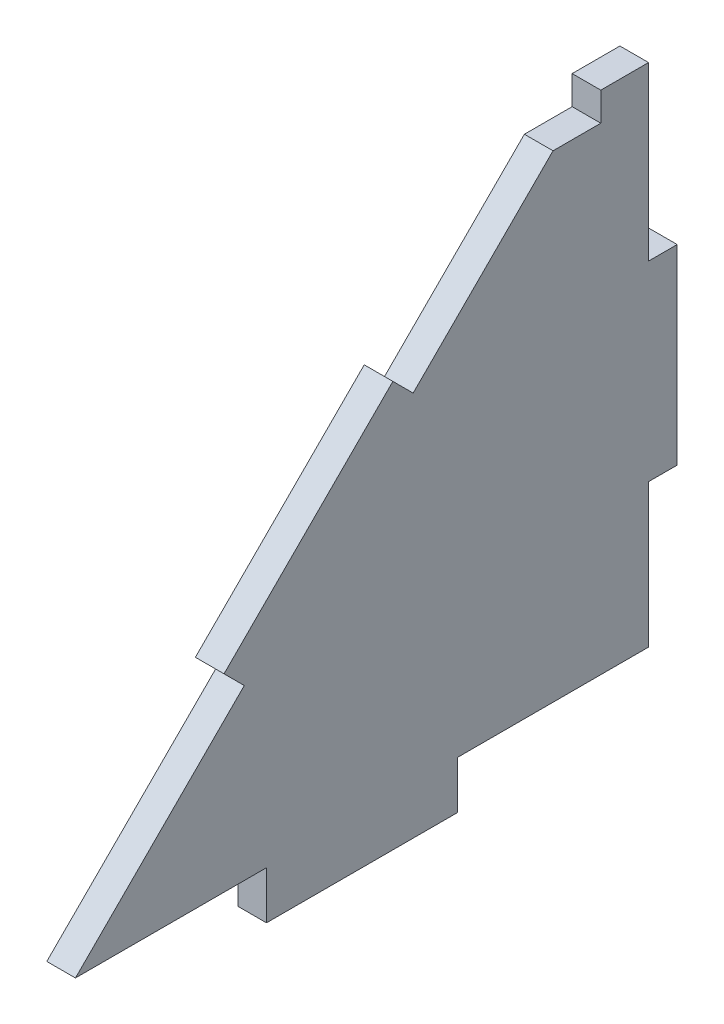
ISO-10303-21;
HEADER;
FILE_DESCRIPTION(('STEP AP214'),'2;1');
FILE_NAME('part.step','',(''),(''),'','','');
FILE_SCHEMA(('AUTOMOTIVE_DESIGN { 1 0 10303 214 1 1 1 1 }'));
ENDSEC;
DATA;
#1=APPLICATION_CONTEXT('core data for automotive mechanical design processes');
#2=APPLICATION_PROTOCOL_DEFINITION('international standard','automotive_design',2000,#1);
#3=PRODUCT_CONTEXT('',#1,'mechanical');
#4=PRODUCT('Part','Part','',(#3));
#5=PRODUCT_RELATED_PRODUCT_CATEGORY('part','',(#4));
#6=PRODUCT_DEFINITION_FORMATION('','',#4);
#7=PRODUCT_DEFINITION_CONTEXT('part definition',#1,'design');
#8=PRODUCT_DEFINITION('design','',#6,#7);
#9=PRODUCT_DEFINITION_SHAPE('','',#8);
#10=(LENGTH_UNIT() NAMED_UNIT(*) SI_UNIT(.MILLI.,.METRE.));
#11=(NAMED_UNIT(*) PLANE_ANGLE_UNIT() SI_UNIT($,.RADIAN.));
#12=(NAMED_UNIT(*) SI_UNIT($,.STERADIAN.) SOLID_ANGLE_UNIT());
#13=UNCERTAINTY_MEASURE_WITH_UNIT(LENGTH_MEASURE(1.E-05),#10,'distance_accuracy_value','');
#14=(GEOMETRIC_REPRESENTATION_CONTEXT(3) GLOBAL_UNCERTAINTY_ASSIGNED_CONTEXT((#13)) GLOBAL_UNIT_ASSIGNED_CONTEXT((#10,
#11,#12)) REPRESENTATION_CONTEXT('',''));
#15=CARTESIAN_POINT('',(0.,0.,0.));
#16=DIRECTION('',(0.,0.,1.));
#17=DIRECTION('',(1.,0.,0.));
#18=AXIS2_PLACEMENT_3D('',#15,#16,#17);
#19=CARTESIAN_POINT('',(3.,0.,-51.8));
#20=DIRECTION('',(0.,0.,-1.));
#21=DIRECTION('',(-1.,0.,0.));
#22=AXIS2_PLACEMENT_3D('',#19,#20,#21);
#23=PLANE('',#22);
#24=DIRECTION('',(0.,-1.,0.));
#25=VECTOR('',#24,1.);
#26=CARTESIAN_POINT('',(0.,0.,-51.8));
#27=LINE('',#26,#25);
#28=CARTESIAN_POINT('',(0.,50.,-51.8));
#29=VERTEX_POINT('',#28);
#30=CARTESIAN_POINT('',(0.,32.,-51.8));
#31=VERTEX_POINT('',#30);
#32=EDGE_CURVE('E203',#29,#31,#27,.T.);
#33=ORIENTED_EDGE('',*,*,#32,.F.);
#34=DIRECTION('',(-1.,0.,0.));
#35=VECTOR('',#34,1.);
#36=CARTESIAN_POINT('',(3.,50.,-51.8));
#37=LINE('',#36,#35);
#38=CARTESIAN_POINT('',(3.,50.,-51.8));
#39=VERTEX_POINT('',#38);
#40=EDGE_CURVE('E12',#39,#29,#37,.T.);
#41=ORIENTED_EDGE('',*,*,#40,.F.);
#42=DIRECTION('',(0.,-1.,0.));
#43=VECTOR('',#42,1.);
#44=CARTESIAN_POINT('',(3.,0.,-51.8));
#45=LINE('',#44,#43);
#46=CARTESIAN_POINT('',(3.,32.,-51.8));
#47=VERTEX_POINT('',#46);
#48=EDGE_CURVE('E266',#39,#47,#45,.T.);
#49=ORIENTED_EDGE('',*,*,#48,.T.);
#50=DIRECTION('',(-1.,0.,0.));
#51=VECTOR('',#50,1.);
#52=CARTESIAN_POINT('',(3.,32.,-51.8));
#53=LINE('',#52,#51);
#54=EDGE_CURVE('E63',#47,#31,#53,.T.);
#55=ORIENTED_EDGE('',*,*,#54,.T.);
#56=EDGE_LOOP('',(#33,#41,#49,#55));
#57=FACE_BOUND('',#56,.T.);
#58=ADVANCED_FACE('F46',(#57),#23,.T.);
#59=CARTESIAN_POINT('',(3.,50.,0.));
#60=DIRECTION('',(0.,1.,0.));
#61=DIRECTION('',(0.,0.,1.));
#62=AXIS2_PLACEMENT_3D('',#59,#60,#61);
#63=PLANE('',#62);
#64=DIRECTION('',(0.,0.,-1.));
#65=VECTOR('',#64,1.);
#66=CARTESIAN_POINT('',(0.,50.,0.));
#67=LINE('',#66,#65);
#68=CARTESIAN_POINT('',(0.,50.,-46.8));
#69=VERTEX_POINT('',#68);
#70=EDGE_CURVE('E206',#69,#29,#67,.T.);
#71=ORIENTED_EDGE('',*,*,#70,.F.);
#72=DIRECTION('',(-1.,0.,0.));
#73=VECTOR('',#72,1.);
#74=CARTESIAN_POINT('',(3.,50.,-46.8));
#75=LINE('',#74,#73);
#76=CARTESIAN_POINT('',(3.,50.,-46.8));
#77=VERTEX_POINT('',#76);
#78=EDGE_CURVE('E55',#77,#69,#75,.T.);
#79=ORIENTED_EDGE('',*,*,#78,.F.);
#80=DIRECTION('',(0.,0.,-1.));
#81=VECTOR('',#80,1.);
#82=CARTESIAN_POINT('',(3.,50.,0.));
#83=LINE('',#82,#81);
#84=EDGE_CURVE('E335',#77,#39,#83,.T.);
#85=ORIENTED_EDGE('',*,*,#84,.T.);
#86=ORIENTED_EDGE('',*,*,#40,.T.);
#87=EDGE_LOOP('',(#71,#79,#85,#86));
#88=FACE_BOUND('',#87,.T.);
#89=ADVANCED_FACE('F324',(#88),#63,.T.);
#90=CARTESIAN_POINT('',(3.,0.,-46.8));
#91=DIRECTION('',(0.,0.,1.));
#92=DIRECTION('',(1.,0.,0.));
#93=AXIS2_PLACEMENT_3D('',#90,#91,#92);
#94=PLANE('',#93);
#95=DIRECTION('',(0.,1.,0.));
#96=VECTOR('',#95,1.);
#97=CARTESIAN_POINT('',(0.,0.,-46.8));
#98=LINE('',#97,#96);
#99=CARTESIAN_POINT('',(0.,47.,-46.8));
#100=VERTEX_POINT('',#99);
#101=EDGE_CURVE('E210',#100,#69,#98,.T.);
#102=ORIENTED_EDGE('',*,*,#101,.F.);
#103=DIRECTION('',(-1.,0.,0.));
#104=VECTOR('',#103,1.);
#105=CARTESIAN_POINT('',(3.,47.,-46.8));
#106=LINE('',#105,#104);
#107=CARTESIAN_POINT('',(3.,47.,-46.8));
#108=VERTEX_POINT('',#107);
#109=EDGE_CURVE('E311',#108,#100,#106,.T.);
#110=ORIENTED_EDGE('',*,*,#109,.F.);
#111=DIRECTION('',(0.,1.,0.));
#112=VECTOR('',#111,1.);
#113=CARTESIAN_POINT('',(3.,0.,-46.8));
#114=LINE('',#113,#112);
#115=EDGE_CURVE('E320',#108,#77,#114,.T.);
#116=ORIENTED_EDGE('',*,*,#115,.T.);
#117=ORIENTED_EDGE('',*,*,#78,.T.);
#118=EDGE_LOOP('',(#102,#110,#116,#117));
#119=FACE_BOUND('',#118,.T.);
#120=ADVANCED_FACE('F318',(#119),#94,.T.);
#121=CARTESIAN_POINT('',(3.,47.,0.));
#122=DIRECTION('',(0.,1.,0.));
#123=DIRECTION('',(0.,0.,1.));
#124=AXIS2_PLACEMENT_3D('',#121,#122,#123);
#125=PLANE('',#124);
#126=DIRECTION('',(0.,0.,-1.));
#127=VECTOR('',#126,1.);
#128=CARTESIAN_POINT('',(0.,47.,0.));
#129=LINE('',#128,#127);
#130=CARTESIAN_POINT('',(0.,47.,-41.8));
#131=VERTEX_POINT('',#130);
#132=EDGE_CURVE('E214',#131,#100,#129,.T.);
#133=ORIENTED_EDGE('',*,*,#132,.F.);
#134=DIRECTION('',(-1.,0.,0.));
#135=VECTOR('',#134,1.);
#136=CARTESIAN_POINT('',(3.,47.,-41.8));
#137=LINE('',#136,#135);
#138=CARTESIAN_POINT('',(3.,47.,-41.8));
#139=VERTEX_POINT('',#138);
#140=EDGE_CURVE('E308',#139,#131,#137,.T.);
#141=ORIENTED_EDGE('',*,*,#140,.F.);
#142=DIRECTION('',(0.,0.,-1.));
#143=VECTOR('',#142,1.);
#144=CARTESIAN_POINT('',(3.,47.,0.));
#145=LINE('',#144,#143);
#146=EDGE_CURVE('E334',#139,#108,#145,.T.);
#147=ORIENTED_EDGE('',*,*,#146,.T.);
#148=ORIENTED_EDGE('',*,*,#109,.T.);
#149=EDGE_LOOP('',(#133,#141,#147,#148));
#150=FACE_BOUND('',#149,.T.);
#151=ADVANCED_FACE('F330',(#150),#125,.T.);
#152=CARTESIAN_POINT('',(3.,2.60000000000003,2.60000000000003));
#153=DIRECTION('',(0.,-0.707106781186548,-0.707106781186547));
#154=DIRECTION('',(0.,0.707106781186547,-0.707106781186548));
#155=AXIS2_PLACEMENT_3D('',#152,#153,#154);
#156=PLANE('',#155);
#157=DIRECTION('',(0.,-0.707106781186547,0.707106781186548));
#158=VECTOR('',#157,1.);
#159=CARTESIAN_POINT('',(0.,2.60000000000003,2.60000000000003));
#160=LINE('',#159,#158);
#161=CARTESIAN_POINT('',(0.,32.3553390593274,-27.1553390593273));
#162=VERTEX_POINT('',#161);
#163=EDGE_CURVE('E218',#131,#162,#160,.T.);
#164=ORIENTED_EDGE('',*,*,#163,.T.);
#165=DIRECTION('',(-1.,0.,0.));
#166=VECTOR('',#165,1.);
#167=CARTESIAN_POINT('',(3.,32.3553390593274,-27.1553390593273));
#168=LINE('',#167,#166);
#169=CARTESIAN_POINT('',(3.,32.3553390593274,-27.1553390593273));
#170=VERTEX_POINT('',#169);
#171=EDGE_CURVE('E305',#170,#162,#168,.T.);
#172=ORIENTED_EDGE('',*,*,#171,.F.);
#173=DIRECTION('',(0.,-0.707106781186547,0.707106781186548));
#174=VECTOR('',#173,1.);
#175=CARTESIAN_POINT('',(3.,2.60000000000003,2.60000000000003));
#176=LINE('',#175,#174);
#177=EDGE_CURVE('E340',#139,#170,#176,.T.);
#178=ORIENTED_EDGE('',*,*,#177,.F.);
#179=ORIENTED_EDGE('',*,*,#140,.T.);
#180=EDGE_LOOP('',(#164,#172,#178,#179));
#181=FACE_BOUND('',#180,.T.);
#182=ADVANCED_FACE('F403',(#181),#156,.F.);
#183=CARTESIAN_POINT('',(3.,29.7553390593274,-29.7553390593273));
#184=DIRECTION('',(0.,0.707106781186548,-0.707106781186547));
#185=DIRECTION('',(0.,0.707106781186547,0.707106781186548));
#186=AXIS2_PLACEMENT_3D('',#183,#184,#185);
#187=PLANE('',#186);
#188=DIRECTION('',(0.,-0.707106781186547,-0.707106781186548));
#189=VECTOR('',#188,1.);
#190=CARTESIAN_POINT('',(0.,29.7553390593274,-29.7553390593273));
#191=LINE('',#190,#189);
#192=CARTESIAN_POINT('',(0.,34.476659402887,-25.0340187157677));
#193=VERTEX_POINT('',#192);
#194=EDGE_CURVE('E222',#193,#162,#191,.T.);
#195=ORIENTED_EDGE('',*,*,#194,.F.);
#196=DIRECTION('',(-1.,0.,0.));
#197=VECTOR('',#196,1.);
#198=CARTESIAN_POINT('',(3.,34.476659402887,-25.0340187157677));
#199=LINE('',#198,#197);
#200=CARTESIAN_POINT('',(3.,34.476659402887,-25.0340187157677));
#201=VERTEX_POINT('',#200);
#202=EDGE_CURVE('E302',#201,#193,#199,.T.);
#203=ORIENTED_EDGE('',*,*,#202,.F.);
#204=DIRECTION('',(0.,-0.707106781186547,-0.707106781186548));
#205=VECTOR('',#204,1.);
#206=CARTESIAN_POINT('',(3.,29.7553390593274,-29.7553390593273));
#207=LINE('',#206,#205);
#208=EDGE_CURVE('E347',#201,#170,#207,.T.);
#209=ORIENTED_EDGE('',*,*,#208,.T.);
#210=ORIENTED_EDGE('',*,*,#171,.T.);
#211=EDGE_LOOP('',(#195,#203,#209,#210));
#212=FACE_BOUND('',#211,.T.);
#213=ADVANCED_FACE('F406',(#212),#187,.T.);
#214=CARTESIAN_POINT('',(3.,4.72132034355966,4.72132034355965));
#215=DIRECTION('',(0.,0.707106781186548,0.707106781186547));
#216=DIRECTION('',(0.,-0.707106781186547,0.707106781186548));
#217=AXIS2_PLACEMENT_3D('',#214,#215,#216);
#218=PLANE('',#217);
#219=DIRECTION('',(0.,0.707106781186547,-0.707106781186548));
#220=VECTOR('',#219,1.);
#221=CARTESIAN_POINT('',(0.,4.72132034355966,4.72132034355965));
#222=LINE('',#221,#220);
#223=CARTESIAN_POINT('',(0.,16.7989898732233,-7.35634918610405));
#224=VERTEX_POINT('',#223);
#225=EDGE_CURVE('E226',#224,#193,#222,.T.);
#226=ORIENTED_EDGE('',*,*,#225,.F.);
#227=DIRECTION('',(-1.,0.,0.));
#228=VECTOR('',#227,1.);
#229=CARTESIAN_POINT('',(3.,16.7989898732233,-7.35634918610405));
#230=LINE('',#229,#228);
#231=CARTESIAN_POINT('',(3.,16.7989898732233,-7.35634918610405));
#232=VERTEX_POINT('',#231);
#233=EDGE_CURVE('E299',#232,#224,#230,.T.);
#234=ORIENTED_EDGE('',*,*,#233,.F.);
#235=DIRECTION('',(0.,0.707106781186547,-0.707106781186548));
#236=VECTOR('',#235,1.);
#237=CARTESIAN_POINT('',(3.,4.72132034355966,4.72132034355965));
#238=LINE('',#237,#236);
#239=EDGE_CURVE('E351',#232,#201,#238,.T.);
#240=ORIENTED_EDGE('',*,*,#239,.T.);
#241=ORIENTED_EDGE('',*,*,#202,.T.);
#242=EDGE_LOOP('',(#226,#234,#240,#241));
#243=FACE_BOUND('',#242,.T.);
#244=ADVANCED_FACE('F410',(#243),#218,.T.);
#245=CARTESIAN_POINT('',(3.,12.0776695296636,-12.0776695296638));
#246=DIRECTION('',(0.,-0.707106781186542,0.707106781186553));
#247=DIRECTION('',(0.,-0.707106781186553,-0.707106781186542));
#248=AXIS2_PLACEMENT_3D('',#245,#246,#247);
#249=PLANE('',#248);
#250=DIRECTION('',(0.,0.707106781186553,0.707106781186542));
#251=VECTOR('',#250,1.);
#252=CARTESIAN_POINT('',(0.,12.0776695296636,-12.0776695296638));
#253=LINE('',#252,#251);
#254=CARTESIAN_POINT('',(0.,14.6776695296637,-9.47766952966366));
#255=VERTEX_POINT('',#254);
#256=EDGE_CURVE('E230',#255,#224,#253,.T.);
#257=ORIENTED_EDGE('',*,*,#256,.F.);
#258=DIRECTION('',(-1.,0.,0.));
#259=VECTOR('',#258,1.);
#260=CARTESIAN_POINT('',(3.,14.6776695296637,-9.47766952966366));
#261=LINE('',#260,#259);
#262=CARTESIAN_POINT('',(3.,14.6776695296637,-9.47766952966366));
#263=VERTEX_POINT('',#262);
#264=EDGE_CURVE('E296',#263,#255,#261,.T.);
#265=ORIENTED_EDGE('',*,*,#264,.F.);
#266=DIRECTION('',(0.,0.707106781186553,0.707106781186542));
#267=VECTOR('',#266,1.);
#268=CARTESIAN_POINT('',(3.,12.0776695296636,-12.0776695296638));
#269=LINE('',#268,#267);
#270=EDGE_CURVE('E355',#263,#232,#269,.T.);
#271=ORIENTED_EDGE('',*,*,#270,.T.);
#272=ORIENTED_EDGE('',*,*,#233,.T.);
#273=EDGE_LOOP('',(#257,#265,#271,#272));
#274=FACE_BOUND('',#273,.T.);
#275=ADVANCED_FACE('F414',(#274),#249,.T.);
#276=CARTESIAN_POINT('',(3.,2.60000000000001,2.60000000000001));
#277=DIRECTION('',(0.,-0.707106781186547,-0.707106781186548));
#278=DIRECTION('',(0.,0.707106781186548,-0.707106781186547));
#279=AXIS2_PLACEMENT_3D('',#276,#277,#278);
#280=PLANE('',#279);
#281=DIRECTION('',(0.,-0.707106781186548,0.707106781186547));
#282=VECTOR('',#281,1.);
#283=CARTESIAN_POINT('',(0.,2.60000000000001,2.60000000000001));
#284=LINE('',#283,#282);
#285=CARTESIAN_POINT('',(0.,-3.,8.20000000000001));
#286=VERTEX_POINT('',#285);
#287=EDGE_CURVE('E234',#255,#286,#284,.T.);
#288=ORIENTED_EDGE('',*,*,#287,.T.);
#289=DIRECTION('',(-1.,0.,0.));
#290=VECTOR('',#289,1.);
#291=CARTESIAN_POINT('',(3.,-3.,8.20000000000001));
#292=LINE('',#291,#290);
#293=CARTESIAN_POINT('',(3.,-3.,8.20000000000001));
#294=VERTEX_POINT('',#293);
#295=EDGE_CURVE('E292',#294,#286,#292,.T.);
#296=ORIENTED_EDGE('',*,*,#295,.F.);
#297=DIRECTION('',(0.,-0.707106781186548,0.707106781186547));
#298=VECTOR('',#297,1.);
#299=CARTESIAN_POINT('',(3.,2.60000000000001,2.60000000000001));
#300=LINE('',#299,#298);
#301=EDGE_CURVE('E359',#263,#294,#300,.T.);
#302=ORIENTED_EDGE('',*,*,#301,.F.);
#303=ORIENTED_EDGE('',*,*,#264,.T.);
#304=EDGE_LOOP('',(#288,#296,#302,#303));
#305=FACE_BOUND('',#304,.T.);
#306=ADVANCED_FACE('F418',(#305),#280,.F.);
#307=CARTESIAN_POINT('',(3.,-3.,0.));
#308=DIRECTION('',(0.,1.,0.));
#309=DIRECTION('',(0.,0.,1.));
#310=AXIS2_PLACEMENT_3D('',#307,#308,#309);
#311=PLANE('',#310);
#312=DIRECTION('',(0.,0.,-1.));
#313=VECTOR('',#312,1.);
#314=CARTESIAN_POINT('',(0.,-3.,0.));
#315=LINE('',#314,#313);
#316=CARTESIAN_POINT('',(0.,-3.,-11.8));
#317=VERTEX_POINT('',#316);
#318=EDGE_CURVE('E237',#286,#317,#315,.T.);
#319=ORIENTED_EDGE('',*,*,#318,.T.);
#320=DIRECTION('',(-1.,0.,0.));
#321=VECTOR('',#320,1.);
#322=CARTESIAN_POINT('',(3.,-3.,-11.8));
#323=LINE('',#322,#321);
#324=CARTESIAN_POINT('',(3.,-3.,-11.8));
#325=VERTEX_POINT('',#324);
#326=EDGE_CURVE('E288',#325,#317,#323,.T.);
#327=ORIENTED_EDGE('',*,*,#326,.F.);
#328=DIRECTION('',(0.,0.,-1.));
#329=VECTOR('',#328,1.);
#330=CARTESIAN_POINT('',(3.,-3.,0.));
#331=LINE('',#330,#329);
#332=EDGE_CURVE('E362',#294,#325,#331,.T.);
#333=ORIENTED_EDGE('',*,*,#332,.F.);
#334=ORIENTED_EDGE('',*,*,#295,.T.);
#335=EDGE_LOOP('',(#319,#327,#333,#334));
#336=FACE_BOUND('',#335,.T.);
#337=ADVANCED_FACE('F422',(#336),#311,.F.);
#338=CARTESIAN_POINT('',(3.,0.,-11.8));
#339=DIRECTION('',(0.,0.,-1.));
#340=DIRECTION('',(0.,1.,0.));
#341=AXIS2_PLACEMENT_3D('',#338,#339,#340);
#342=PLANE('',#341);
#343=DIRECTION('',(0.,-1.,0.));
#344=VECTOR('',#343,1.);
#345=CARTESIAN_POINT('',(0.,0.,-11.8));
#346=LINE('',#345,#344);
#347=CARTESIAN_POINT('',(0.,-8.00000000000001,-11.8));
#348=VERTEX_POINT('',#347);
#349=EDGE_CURVE('E240',#317,#348,#346,.T.);
#350=ORIENTED_EDGE('',*,*,#349,.T.);
#351=DIRECTION('',(-1.,0.,0.));
#352=VECTOR('',#351,1.);
#353=CARTESIAN_POINT('',(3.,-8.00000000000001,-11.8));
#354=LINE('',#353,#352);
#355=CARTESIAN_POINT('',(3.,-8.00000000000001,-11.8));
#356=VERTEX_POINT('',#355);
#357=EDGE_CURVE('E284',#356,#348,#354,.T.);
#358=ORIENTED_EDGE('',*,*,#357,.F.);
#359=DIRECTION('',(0.,-1.,0.));
#360=VECTOR('',#359,1.);
#361=CARTESIAN_POINT('',(3.,0.,-11.8));
#362=LINE('',#361,#360);
#363=EDGE_CURVE('E365',#325,#356,#362,.T.);
#364=ORIENTED_EDGE('',*,*,#363,.F.);
#365=ORIENTED_EDGE('',*,*,#326,.T.);
#366=EDGE_LOOP('',(#350,#358,#364,#365));
#367=FACE_BOUND('',#366,.T.);
#368=ADVANCED_FACE('F426',(#367),#342,.F.);
#369=CARTESIAN_POINT('',(3.,-8.00000000000001,0.));
#370=DIRECTION('',(0.,1.,0.));
#371=DIRECTION('',(0.,0.,1.));
#372=AXIS2_PLACEMENT_3D('',#369,#370,#371);
#373=PLANE('',#372);
#374=DIRECTION('',(0.,0.,-1.));
#375=VECTOR('',#374,1.);
#376=CARTESIAN_POINT('',(0.,-8.00000000000001,0.));
#377=LINE('',#376,#375);
#378=CARTESIAN_POINT('',(0.,-8.00000000000001,-31.8));
#379=VERTEX_POINT('',#378);
#380=EDGE_CURVE('E243',#348,#379,#377,.T.);
#381=ORIENTED_EDGE('',*,*,#380,.T.);
#382=DIRECTION('',(-1.,0.,0.));
#383=VECTOR('',#382,1.);
#384=CARTESIAN_POINT('',(3.,-8.00000000000001,-31.8));
#385=LINE('',#384,#383);
#386=CARTESIAN_POINT('',(3.,-8.00000000000001,-31.8));
#387=VERTEX_POINT('',#386);
#388=EDGE_CURVE('E280',#387,#379,#385,.T.);
#389=ORIENTED_EDGE('',*,*,#388,.F.);
#390=DIRECTION('',(0.,0.,-1.));
#391=VECTOR('',#390,1.);
#392=CARTESIAN_POINT('',(3.,-8.00000000000001,0.));
#393=LINE('',#392,#391);
#394=EDGE_CURVE('E368',#356,#387,#393,.T.);
#395=ORIENTED_EDGE('',*,*,#394,.F.);
#396=ORIENTED_EDGE('',*,*,#357,.T.);
#397=EDGE_LOOP('',(#381,#389,#395,#396));
#398=FACE_BOUND('',#397,.T.);
#399=ADVANCED_FACE('F430',(#398),#373,.F.);
#400=CARTESIAN_POINT('',(3.,0.,-31.8));
#401=DIRECTION('',(0.,0.,1.));
#402=DIRECTION('',(1.,0.,0.));
#403=AXIS2_PLACEMENT_3D('',#400,#401,#402);
#404=PLANE('',#403);
#405=DIRECTION('',(0.,1.,0.));
#406=VECTOR('',#405,1.);
#407=CARTESIAN_POINT('',(0.,0.,-31.8));
#408=LINE('',#407,#406);
#409=CARTESIAN_POINT('',(0.,-3.,-31.8));
#410=VERTEX_POINT('',#409);
#411=EDGE_CURVE('E246',#379,#410,#408,.T.);
#412=ORIENTED_EDGE('',*,*,#411,.T.);
#413=DIRECTION('',(-1.,0.,0.));
#414=VECTOR('',#413,1.);
#415=CARTESIAN_POINT('',(3.,-3.,-31.8));
#416=LINE('',#415,#414);
#417=CARTESIAN_POINT('',(3.,-3.,-31.8));
#418=VERTEX_POINT('',#417);
#419=EDGE_CURVE('E276',#418,#410,#416,.T.);
#420=ORIENTED_EDGE('',*,*,#419,.F.);
#421=DIRECTION('',(0.,1.,0.));
#422=VECTOR('',#421,1.);
#423=CARTESIAN_POINT('',(3.,0.,-31.8));
#424=LINE('',#423,#422);
#425=EDGE_CURVE('E371',#387,#418,#424,.T.);
#426=ORIENTED_EDGE('',*,*,#425,.F.);
#427=ORIENTED_EDGE('',*,*,#388,.T.);
#428=EDGE_LOOP('',(#412,#420,#426,#427));
#429=FACE_BOUND('',#428,.T.);
#430=ADVANCED_FACE('F434',(#429),#404,.F.);
#431=CARTESIAN_POINT('',(3.,-3.00000000000001,0.));
#432=DIRECTION('',(0.,1.,0.));
#433=DIRECTION('',(0.,0.,1.));
#434=AXIS2_PLACEMENT_3D('',#431,#432,#433);
#435=PLANE('',#434);
#436=DIRECTION('',(0.,0.,-1.));
#437=VECTOR('',#436,1.);
#438=CARTESIAN_POINT('',(0.,-3.00000000000001,0.));
#439=LINE('',#438,#437);
#440=CARTESIAN_POINT('',(0.,-3.,-51.8));
#441=VERTEX_POINT('',#440);
#442=EDGE_CURVE('E249',#410,#441,#439,.T.);
#443=ORIENTED_EDGE('',*,*,#442,.T.);
#444=DIRECTION('',(-1.,0.,0.));
#445=VECTOR('',#444,1.);
#446=CARTESIAN_POINT('',(3.,-3.,-51.8));
#447=LINE('',#446,#445);
#448=CARTESIAN_POINT('',(3.,-3.,-51.8));
#449=VERTEX_POINT('',#448);
#450=EDGE_CURVE('E273',#449,#441,#447,.T.);
#451=ORIENTED_EDGE('',*,*,#450,.F.);
#452=DIRECTION('',(0.,0.,-1.));
#453=VECTOR('',#452,1.);
#454=CARTESIAN_POINT('',(3.,-3.00000000000001,0.));
#455=LINE('',#454,#453);
#456=EDGE_CURVE('E374',#418,#449,#455,.T.);
#457=ORIENTED_EDGE('',*,*,#456,.F.);
#458=ORIENTED_EDGE('',*,*,#419,.T.);
#459=EDGE_LOOP('',(#443,#451,#457,#458));
#460=FACE_BOUND('',#459,.T.);
#461=ADVANCED_FACE('F438',(#460),#435,.F.);
#462=CARTESIAN_POINT('',(3.,0.,-51.8));
#463=DIRECTION('',(0.,0.,-1.));
#464=DIRECTION('',(-1.,0.,0.));
#465=AXIS2_PLACEMENT_3D('',#462,#463,#464);
#466=PLANE('',#465);
#467=DIRECTION('',(0.,-1.,0.));
#468=VECTOR('',#467,1.);
#469=CARTESIAN_POINT('',(0.,0.,-51.8));
#470=LINE('',#469,#468);
#471=CARTESIAN_POINT('',(0.,12.,-51.8));
#472=VERTEX_POINT('',#471);
#473=EDGE_CURVE('E253',#472,#441,#470,.T.);
#474=ORIENTED_EDGE('',*,*,#473,.F.);
#475=DIRECTION('',(-1.,0.,0.));
#476=VECTOR('',#475,1.);
#477=CARTESIAN_POINT('',(3.,12.,-51.8));
#478=LINE('',#477,#476);
#479=CARTESIAN_POINT('',(3.,12.,-51.8));
#480=VERTEX_POINT('',#479);
#481=EDGE_CURVE('E193',#480,#472,#478,.T.);
#482=ORIENTED_EDGE('',*,*,#481,.F.);
#483=DIRECTION('',(0.,-1.,0.));
#484=VECTOR('',#483,1.);
#485=CARTESIAN_POINT('',(3.,0.,-51.8));
#486=LINE('',#485,#484);
#487=EDGE_CURVE('E181',#480,#449,#486,.T.);
#488=ORIENTED_EDGE('',*,*,#487,.T.);
#489=ORIENTED_EDGE('',*,*,#450,.T.);
#490=EDGE_LOOP('',(#474,#482,#488,#489));
#491=FACE_BOUND('',#490,.T.);
#492=ADVANCED_FACE('F379',(#491),#466,.T.);
#493=CARTESIAN_POINT('',(3.,12.,0.));
#494=DIRECTION('',(0.,1.,0.));
#495=DIRECTION('',(0.,0.,1.));
#496=AXIS2_PLACEMENT_3D('',#493,#494,#495);
#497=PLANE('',#496);
#498=DIRECTION('',(0.,0.,-1.));
#499=VECTOR('',#498,1.);
#500=CARTESIAN_POINT('',(0.,12.,0.));
#501=LINE('',#500,#499);
#502=CARTESIAN_POINT('',(0.,12.,-54.8));
#503=VERTEX_POINT('',#502);
#504=EDGE_CURVE('E189',#472,#503,#501,.T.);
#505=ORIENTED_EDGE('',*,*,#504,.T.);
#506=DIRECTION('',(-1.,0.,0.));
#507=VECTOR('',#506,1.);
#508=CARTESIAN_POINT('',(3.,12.,-54.8));
#509=LINE('',#508,#507);
#510=CARTESIAN_POINT('',(3.,12.,-54.8));
#511=VERTEX_POINT('',#510);
#512=EDGE_CURVE('E186',#511,#503,#509,.T.);
#513=ORIENTED_EDGE('',*,*,#512,.F.);
#514=DIRECTION('',(0.,0.,-1.));
#515=VECTOR('',#514,1.);
#516=CARTESIAN_POINT('',(3.,12.,0.));
#517=LINE('',#516,#515);
#518=EDGE_CURVE('E174',#480,#511,#517,.T.);
#519=ORIENTED_EDGE('',*,*,#518,.F.);
#520=ORIENTED_EDGE('',*,*,#481,.T.);
#521=EDGE_LOOP('',(#505,#513,#519,#520));
#522=FACE_BOUND('',#521,.T.);
#523=ADVANCED_FACE('F187',(#522),#497,.F.);
#524=CARTESIAN_POINT('',(3.,0.,-54.8));
#525=DIRECTION('',(0.,0.,-1.));
#526=DIRECTION('',(0.,1.,0.));
#527=AXIS2_PLACEMENT_3D('',#524,#525,#526);
#528=PLANE('',#527);
#529=DIRECTION('',(0.,-1.,0.));
#530=VECTOR('',#529,1.);
#531=CARTESIAN_POINT('',(0.,0.,-54.8));
#532=LINE('',#531,#530);
#533=CARTESIAN_POINT('',(0.,32.,-54.8));
#534=VERTEX_POINT('',#533);
#535=EDGE_CURVE('E259',#534,#503,#532,.T.);
#536=ORIENTED_EDGE('',*,*,#535,.F.);
#537=DIRECTION('',(-1.,0.,0.));
#538=VECTOR('',#537,1.);
#539=CARTESIAN_POINT('',(3.,32.,-54.8));
#540=LINE('',#539,#538);
#541=CARTESIAN_POINT('',(3.,32.,-54.8));
#542=VERTEX_POINT('',#541);
#543=EDGE_CURVE('E118',#542,#534,#540,.T.);
#544=ORIENTED_EDGE('',*,*,#543,.F.);
#545=DIRECTION('',(0.,-1.,0.));
#546=VECTOR('',#545,1.);
#547=CARTESIAN_POINT('',(3.,0.,-54.8));
#548=LINE('',#547,#546);
#549=EDGE_CURVE('E179',#542,#511,#548,.T.);
#550=ORIENTED_EDGE('',*,*,#549,.T.);
#551=ORIENTED_EDGE('',*,*,#512,.T.);
#552=EDGE_LOOP('',(#536,#544,#550,#551));
#553=FACE_BOUND('',#552,.T.);
#554=ADVANCED_FACE('F195',(#553),#528,.T.);
#555=CARTESIAN_POINT('',(3.,32.,0.));
#556=DIRECTION('',(0.,1.,0.));
#557=DIRECTION('',(0.,0.,1.));
#558=AXIS2_PLACEMENT_3D('',#555,#556,#557);
#559=PLANE('',#558);
#560=DIRECTION('',(0.,0.,-1.));
#561=VECTOR('',#560,1.);
#562=CARTESIAN_POINT('',(0.,32.,0.));
#563=LINE('',#562,#561);
#564=EDGE_CURVE('E262',#31,#534,#563,.T.);
#565=ORIENTED_EDGE('',*,*,#564,.F.);
#566=ORIENTED_EDGE('',*,*,#54,.F.);
#567=DIRECTION('',(0.,0.,-1.));
#568=VECTOR('',#567,1.);
#569=CARTESIAN_POINT('',(3.,32.,0.));
#570=LINE('',#569,#568);
#571=EDGE_CURVE('E197',#47,#542,#570,.T.);
#572=ORIENTED_EDGE('',*,*,#571,.T.);
#573=ORIENTED_EDGE('',*,*,#543,.T.);
#574=EDGE_LOOP('',(#565,#566,#572,#573));
#575=FACE_BOUND('',#574,.T.);
#576=ADVANCED_FACE('F382',(#575),#559,.T.);
#577=CARTESIAN_POINT('',(3.,0.,0.));
#578=DIRECTION('',(1.,0.,0.));
#579=DIRECTION('',(0.,0.,-1.));
#580=AXIS2_PLACEMENT_3D('',#577,#578,#579);
#581=PLANE('',#580);
#582=ORIENTED_EDGE('',*,*,#48,.F.);
#583=ORIENTED_EDGE('',*,*,#84,.F.);
#584=ORIENTED_EDGE('',*,*,#115,.F.);
#585=ORIENTED_EDGE('',*,*,#146,.F.);
#586=ORIENTED_EDGE('',*,*,#177,.T.);
#587=ORIENTED_EDGE('',*,*,#208,.F.);
#588=ORIENTED_EDGE('',*,*,#239,.F.);
#589=ORIENTED_EDGE('',*,*,#270,.F.);
#590=ORIENTED_EDGE('',*,*,#301,.T.);
#591=ORIENTED_EDGE('',*,*,#332,.T.);
#592=ORIENTED_EDGE('',*,*,#363,.T.);
#593=ORIENTED_EDGE('',*,*,#394,.T.);
#594=ORIENTED_EDGE('',*,*,#425,.T.);
#595=ORIENTED_EDGE('',*,*,#456,.T.);
#596=ORIENTED_EDGE('',*,*,#487,.F.);
#597=ORIENTED_EDGE('',*,*,#518,.T.);
#598=ORIENTED_EDGE('',*,*,#549,.F.);
#599=ORIENTED_EDGE('',*,*,#571,.F.);
#600=EDGE_LOOP('',(#582,#583,#584,#585,#586,#587,#588,#589,#590,#591,#592,#593,#594,#595,#596,
#597,#598,#599));
#601=FACE_BOUND('',#600,.T.);
#602=ADVANCED_FACE('F176',(#601),#581,.T.);
#603=CARTESIAN_POINT('',(0.,0.,0.));
#604=DIRECTION('',(1.,0.,0.));
#605=DIRECTION('',(0.,0.,-1.));
#606=AXIS2_PLACEMENT_3D('',#603,#604,#605);
#607=PLANE('',#606);
#608=ORIENTED_EDGE('',*,*,#32,.T.);
#609=ORIENTED_EDGE('',*,*,#564,.T.);
#610=ORIENTED_EDGE('',*,*,#535,.T.);
#611=ORIENTED_EDGE('',*,*,#504,.F.);
#612=ORIENTED_EDGE('',*,*,#473,.T.);
#613=ORIENTED_EDGE('',*,*,#442,.F.);
#614=ORIENTED_EDGE('',*,*,#411,.F.);
#615=ORIENTED_EDGE('',*,*,#380,.F.);
#616=ORIENTED_EDGE('',*,*,#349,.F.);
#617=ORIENTED_EDGE('',*,*,#318,.F.);
#618=ORIENTED_EDGE('',*,*,#287,.F.);
#619=ORIENTED_EDGE('',*,*,#256,.T.);
#620=ORIENTED_EDGE('',*,*,#225,.T.);
#621=ORIENTED_EDGE('',*,*,#194,.T.);
#622=ORIENTED_EDGE('',*,*,#163,.F.);
#623=ORIENTED_EDGE('',*,*,#132,.T.);
#624=ORIENTED_EDGE('',*,*,#101,.T.);
#625=ORIENTED_EDGE('',*,*,#70,.T.);
#626=EDGE_LOOP('',(#608,#609,#610,#611,#612,#613,#614,#615,#616,#617,#618,#619,#620,#621,#622,
#623,#624,#625));
#627=FACE_BOUND('',#626,.T.);
#628=ADVANCED_FACE('F326',(#627),#607,.F.);
#629=CLOSED_SHELL('',(#58,#89,#120,#151,#182,#213,#244,#275,#306,#337,#368,#399,#430,#461,#492,
#523,#554,#576,#602,#628));
#630=MANIFOLD_SOLID_BREP('B2',#629);
#631=ADVANCED_BREP_SHAPE_REPRESENTATION('',(#18,#630),#14);
#632=SHAPE_DEFINITION_REPRESENTATION(#9,#631);
ENDSEC;
END-ISO-10303-21;
